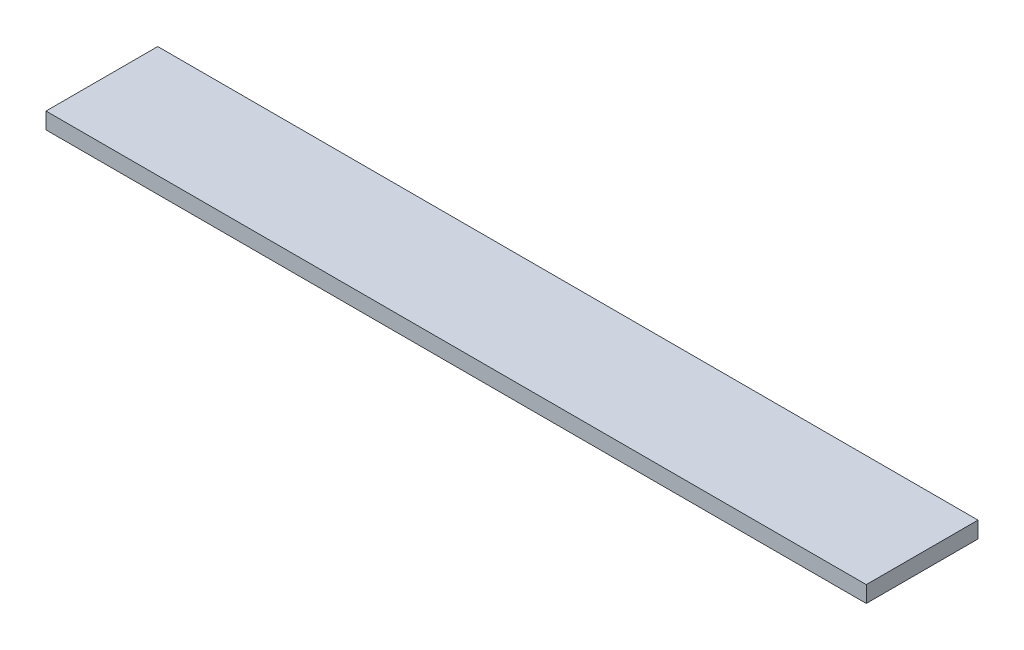
ISO-10303-21;
HEADER;
FILE_DESCRIPTION(('STEP AP214'),'2;1');
FILE_NAME('part.step','',(''),(''),'','','');
FILE_SCHEMA(('AUTOMOTIVE_DESIGN { 1 0 10303 214 1 1 1 1 }'));
ENDSEC;
DATA;
#1=APPLICATION_CONTEXT('core data for automotive mechanical design processes');
#2=APPLICATION_PROTOCOL_DEFINITION('international standard','automotive_design',2000,#1);
#3=PRODUCT_CONTEXT('',#1,'mechanical');
#4=PRODUCT('Part','Part','',(#3));
#5=PRODUCT_RELATED_PRODUCT_CATEGORY('part','',(#4));
#6=PRODUCT_DEFINITION_FORMATION('','',#4);
#7=PRODUCT_DEFINITION_CONTEXT('part definition',#1,'design');
#8=PRODUCT_DEFINITION('design','',#6,#7);
#9=PRODUCT_DEFINITION_SHAPE('','',#8);
#10=(LENGTH_UNIT() NAMED_UNIT(*) SI_UNIT(.MILLI.,.METRE.));
#11=(NAMED_UNIT(*) PLANE_ANGLE_UNIT() SI_UNIT($,.RADIAN.));
#12=(NAMED_UNIT(*) SI_UNIT($,.STERADIAN.) SOLID_ANGLE_UNIT());
#13=UNCERTAINTY_MEASURE_WITH_UNIT(LENGTH_MEASURE(1.E-05),#10,'distance_accuracy_value','');
#14=(GEOMETRIC_REPRESENTATION_CONTEXT(3) GLOBAL_UNCERTAINTY_ASSIGNED_CONTEXT((#13)) GLOBAL_UNIT_ASSIGNED_CONTEXT((#10,
#11,#12)) REPRESENTATION_CONTEXT('',''));
#15=CARTESIAN_POINT('',(0.,0.,0.));
#16=DIRECTION('',(0.,0.,1.));
#17=DIRECTION('',(1.,0.,0.));
#18=AXIS2_PLACEMENT_3D('',#15,#16,#17);
#19=CARTESIAN_POINT('',(0.,1.2,0.));
#20=DIRECTION('',(1.,0.,0.));
#21=DIRECTION('',(0.,0.,-1.));
#22=AXIS2_PLACEMENT_3D('',#19,#20,#21);
#23=PLANE('',#22);
#24=DIRECTION('',(0.,0.,1.));
#25=VECTOR('',#24,1.);
#26=CARTESIAN_POINT('',(0.,0.,0.));
#27=LINE('',#26,#25);
#28=CARTESIAN_POINT('',(0.,0.,0.));
#29=VERTEX_POINT('',#28);
#30=CARTESIAN_POINT('',(0.,0.,8.2));
#31=VERTEX_POINT('',#30);
#32=EDGE_CURVE('E96',#29,#31,#27,.T.);
#33=ORIENTED_EDGE('',*,*,#32,.T.);
#34=DIRECTION('',(0.,-1.,0.));
#35=VECTOR('',#34,1.);
#36=CARTESIAN_POINT('',(0.,1.2,8.2));
#37=LINE('',#36,#35);
#38=CARTESIAN_POINT('',(0.,1.2,8.2));
#39=VERTEX_POINT('',#38);
#40=EDGE_CURVE('E11',#39,#31,#37,.T.);
#41=ORIENTED_EDGE('',*,*,#40,.F.);
#42=DIRECTION('',(0.,0.,1.));
#43=VECTOR('',#42,1.);
#44=CARTESIAN_POINT('',(0.,1.2,0.));
#45=LINE('',#44,#43);
#46=CARTESIAN_POINT('',(0.,1.2,0.));
#47=VERTEX_POINT('',#46);
#48=EDGE_CURVE('E84',#47,#39,#45,.T.);
#49=ORIENTED_EDGE('',*,*,#48,.F.);
#50=DIRECTION('',(0.,-1.,0.));
#51=VECTOR('',#50,1.);
#52=CARTESIAN_POINT('',(0.,1.2,0.));
#53=LINE('',#52,#51);
#54=EDGE_CURVE('E92',#47,#29,#53,.T.);
#55=ORIENTED_EDGE('',*,*,#54,.T.);
#56=EDGE_LOOP('',(#33,#41,#49,#55));
#57=FACE_BOUND('',#56,.T.);
#58=ADVANCED_FACE('F33',(#57),#23,.F.);
#59=CARTESIAN_POINT('',(0.,1.2,8.2));
#60=DIRECTION('',(0.,0.,-1.));
#61=DIRECTION('',(-1.,0.,0.));
#62=AXIS2_PLACEMENT_3D('',#59,#60,#61);
#63=PLANE('',#62);
#64=DIRECTION('',(1.,0.,0.));
#65=VECTOR('',#64,1.);
#66=CARTESIAN_POINT('',(0.,0.,8.2));
#67=LINE('',#66,#65);
#68=CARTESIAN_POINT('',(60.2,0.,8.2));
#69=VERTEX_POINT('',#68);
#70=EDGE_CURVE('E88',#31,#69,#67,.T.);
#71=ORIENTED_EDGE('',*,*,#70,.T.);
#72=DIRECTION('',(0.,-1.,0.));
#73=VECTOR('',#72,1.);
#74=CARTESIAN_POINT('',(60.2,1.2,8.2));
#75=LINE('',#74,#73);
#76=CARTESIAN_POINT('',(60.2,1.2,8.2));
#77=VERTEX_POINT('',#76);
#78=EDGE_CURVE('E41',#77,#69,#75,.T.);
#79=ORIENTED_EDGE('',*,*,#78,.F.);
#80=DIRECTION('',(1.,0.,0.));
#81=VECTOR('',#80,1.);
#82=CARTESIAN_POINT('',(0.,1.2,8.2));
#83=LINE('',#82,#81);
#84=EDGE_CURVE('E79',#39,#77,#83,.T.);
#85=ORIENTED_EDGE('',*,*,#84,.F.);
#86=ORIENTED_EDGE('',*,*,#40,.T.);
#87=EDGE_LOOP('',(#71,#79,#85,#86));
#88=FACE_BOUND('',#87,.T.);
#89=ADVANCED_FACE('F87',(#88),#63,.F.);
#90=CARTESIAN_POINT('',(60.2,1.2,0.));
#91=DIRECTION('',(-1.,0.,0.));
#92=DIRECTION('',(0.,0.,1.));
#93=AXIS2_PLACEMENT_3D('',#90,#91,#92);
#94=PLANE('',#93);
#95=DIRECTION('',(0.,0.,-1.));
#96=VECTOR('',#95,1.);
#97=CARTESIAN_POINT('',(60.2,0.,0.));
#98=LINE('',#97,#96);
#99=CARTESIAN_POINT('',(60.2,0.,0.));
#100=VERTEX_POINT('',#99);
#101=EDGE_CURVE('E66',#69,#100,#98,.T.);
#102=ORIENTED_EDGE('',*,*,#101,.T.);
#103=DIRECTION('',(0.,-1.,0.));
#104=VECTOR('',#103,1.);
#105=CARTESIAN_POINT('',(60.2,1.2,0.));
#106=LINE('',#105,#104);
#107=CARTESIAN_POINT('',(60.2,1.2,0.));
#108=VERTEX_POINT('',#107);
#109=EDGE_CURVE('E89',#108,#100,#106,.T.);
#110=ORIENTED_EDGE('',*,*,#109,.F.);
#111=DIRECTION('',(0.,0.,-1.));
#112=VECTOR('',#111,1.);
#113=CARTESIAN_POINT('',(60.2,1.2,0.));
#114=LINE('',#113,#112);
#115=EDGE_CURVE('E82',#77,#108,#114,.T.);
#116=ORIENTED_EDGE('',*,*,#115,.F.);
#117=ORIENTED_EDGE('',*,*,#78,.T.);
#118=EDGE_LOOP('',(#102,#110,#116,#117));
#119=FACE_BOUND('',#118,.T.);
#120=ADVANCED_FACE('F90',(#119),#94,.F.);
#121=CARTESIAN_POINT('',(0.,1.2,0.));
#122=DIRECTION('',(0.,0.,1.));
#123=DIRECTION('',(1.,0.,0.));
#124=AXIS2_PLACEMENT_3D('',#121,#122,#123);
#125=PLANE('',#124);
#126=DIRECTION('',(-1.,0.,0.));
#127=VECTOR('',#126,1.);
#128=CARTESIAN_POINT('',(0.,0.,0.));
#129=LINE('',#128,#127);
#130=EDGE_CURVE('E72',#100,#29,#129,.T.);
#131=ORIENTED_EDGE('',*,*,#130,.T.);
#132=ORIENTED_EDGE('',*,*,#54,.F.);
#133=DIRECTION('',(-1.,0.,0.));
#134=VECTOR('',#133,1.);
#135=CARTESIAN_POINT('',(0.,1.2,0.));
#136=LINE('',#135,#134);
#137=EDGE_CURVE('E49',#108,#47,#136,.T.);
#138=ORIENTED_EDGE('',*,*,#137,.F.);
#139=ORIENTED_EDGE('',*,*,#109,.T.);
#140=EDGE_LOOP('',(#131,#132,#138,#139));
#141=FACE_BOUND('',#140,.T.);
#142=ADVANCED_FACE('F104',(#141),#125,.F.);
#143=CARTESIAN_POINT('',(0.,1.2,0.));
#144=DIRECTION('',(0.,1.,0.));
#145=DIRECTION('',(0.,0.,1.));
#146=AXIS2_PLACEMENT_3D('',#143,#144,#145);
#147=PLANE('',#146);
#148=ORIENTED_EDGE('',*,*,#48,.T.);
#149=ORIENTED_EDGE('',*,*,#84,.T.);
#150=ORIENTED_EDGE('',*,*,#115,.T.);
#151=ORIENTED_EDGE('',*,*,#137,.T.);
#152=EDGE_LOOP('',(#148,#149,#150,#151));
#153=FACE_BOUND('',#152,.T.);
#154=ADVANCED_FACE('F80',(#153),#147,.T.);
#155=CARTESIAN_POINT('',(0.,0.,0.));
#156=DIRECTION('',(0.,1.,0.));
#157=DIRECTION('',(0.,0.,1.));
#158=AXIS2_PLACEMENT_3D('',#155,#156,#157);
#159=PLANE('',#158);
#160=CARTESIAN_POINT('',(57.8,0.,1.88));
#161=DIRECTION('',(0.,-1.,0.));
#162=DIRECTION('',(0.,0.,-1.));
#163=AXIS2_PLACEMENT_3D('',#160,#161,#162);
#164=CIRCLE('',#163,1.5);
#165=CARTESIAN_POINT('',(57.8,0.,0.379999999999996));
#166=VERTEX_POINT('',#165);
#167=EDGE_CURVE('E122',#166,#166,#164,.T.);
#168=ORIENTED_EDGE('',*,*,#167,.F.);
#169=EDGE_LOOP('',(#168));
#170=FACE_BOUND('',#169,.T.);
#171=CARTESIAN_POINT('',(57.8,0.,6.12));
#172=DIRECTION('',(0.,-1.,0.));
#173=DIRECTION('',(0.,0.,-1.));
#174=AXIS2_PLACEMENT_3D('',#171,#172,#173);
#175=CIRCLE('',#174,1.5);
#176=CARTESIAN_POINT('',(57.8,0.,4.62));
#177=VERTEX_POINT('',#176);
#178=EDGE_CURVE('E116',#177,#177,#175,.T.);
#179=ORIENTED_EDGE('',*,*,#178,.F.);
#180=EDGE_LOOP('',(#179));
#181=FACE_BOUND('',#180,.T.);
#182=CARTESIAN_POINT('',(7.52000000000001,0.,1.87999999999999));
#183=DIRECTION('',(0.,-1.,0.));
#184=DIRECTION('',(0.,0.,-1.));
#185=AXIS2_PLACEMENT_3D('',#182,#183,#184);
#186=CIRCLE('',#185,1.5);
#187=CARTESIAN_POINT('',(7.52000000000001,0.,0.379999999999994));
#188=VERTEX_POINT('',#187);
#189=EDGE_CURVE('E110',#188,#188,#186,.T.);
#190=ORIENTED_EDGE('',*,*,#189,.F.);
#191=EDGE_LOOP('',(#190));
#192=FACE_BOUND('',#191,.T.);
#193=ORIENTED_EDGE('',*,*,#32,.F.);
#194=ORIENTED_EDGE('',*,*,#130,.F.);
#195=ORIENTED_EDGE('',*,*,#101,.F.);
#196=ORIENTED_EDGE('',*,*,#70,.F.);
#197=EDGE_LOOP('',(#193,#194,#195,#196));
#198=FACE_BOUND('',#197,.T.);
#199=ADVANCED_FACE('F107',(#170,#181,#192,#198),#159,.F.);
#200=CARTESIAN_POINT('',(7.52000000000001,0.5,1.87999999999999));
#201=DIRECTION('',(0.,-1.,0.));
#202=DIRECTION('',(0.,0.,-1.));
#203=AXIS2_PLACEMENT_3D('',#200,#201,#202);
#204=CYLINDRICAL_SURFACE('',#203,1.5);
#205=CARTESIAN_POINT('',(7.52000000000001,0.5,1.87999999999999));
#206=DIRECTION('',(0.,-1.,0.));
#207=DIRECTION('',(0.,0.,-1.));
#208=AXIS2_PLACEMENT_3D('',#205,#206,#207);
#209=CIRCLE('',#208,1.5);
#210=CARTESIAN_POINT('',(7.52000000000001,0.5,0.379999999999994));
#211=VERTEX_POINT('',#210);
#212=EDGE_CURVE('E99',#211,#211,#209,.T.);
#213=ORIENTED_EDGE('',*,*,#212,.F.);
#214=EDGE_LOOP('',(#213));
#215=FACE_BOUND('',#214,.T.);
#216=ORIENTED_EDGE('',*,*,#189,.T.);
#217=EDGE_LOOP('',(#216));
#218=FACE_BOUND('',#217,.T.);
#219=ADVANCED_FACE('F139',(#215,#218),#204,.F.);
#220=CARTESIAN_POINT('',(7.52000000000001,0.5,1.87999999999999));
#221=DIRECTION('',(0.,-1.,0.));
#222=DIRECTION('',(0.,0.,-1.));
#223=AXIS2_PLACEMENT_3D('',#220,#221,#222);
#224=PLANE('',#223);
#225=ORIENTED_EDGE('',*,*,#212,.T.);
#226=EDGE_LOOP('',(#225));
#227=FACE_BOUND('',#226,.T.);
#228=ADVANCED_FACE('F146',(#227),#224,.T.);
#229=CARTESIAN_POINT('',(57.8,0.5,6.12));
#230=DIRECTION('',(0.,-1.,0.));
#231=DIRECTION('',(0.,0.,-1.));
#232=AXIS2_PLACEMENT_3D('',#229,#230,#231);
#233=CYLINDRICAL_SURFACE('',#232,1.5);
#234=CARTESIAN_POINT('',(57.8,0.5,6.12));
#235=DIRECTION('',(0.,-1.,0.));
#236=DIRECTION('',(0.,0.,-1.));
#237=AXIS2_PLACEMENT_3D('',#234,#235,#236);
#238=CIRCLE('',#237,1.5);
#239=CARTESIAN_POINT('',(57.8,0.5,4.62));
#240=VERTEX_POINT('',#239);
#241=EDGE_CURVE('E119',#240,#240,#238,.T.);
#242=ORIENTED_EDGE('',*,*,#241,.F.);
#243=EDGE_LOOP('',(#242));
#244=FACE_BOUND('',#243,.T.);
#245=ORIENTED_EDGE('',*,*,#178,.T.);
#246=EDGE_LOOP('',(#245));
#247=FACE_BOUND('',#246,.T.);
#248=ADVANCED_FACE('F153',(#244,#247),#233,.F.);
#249=CARTESIAN_POINT('',(57.8,0.5,6.12));
#250=DIRECTION('',(0.,-1.,0.));
#251=DIRECTION('',(0.,0.,-1.));
#252=AXIS2_PLACEMENT_3D('',#249,#250,#251);
#253=PLANE('',#252);
#254=ORIENTED_EDGE('',*,*,#241,.T.);
#255=EDGE_LOOP('',(#254));
#256=FACE_BOUND('',#255,.T.);
#257=ADVANCED_FACE('F133',(#256),#253,.T.);
#258=CARTESIAN_POINT('',(57.8,0.5,1.88));
#259=DIRECTION('',(0.,-1.,0.));
#260=DIRECTION('',(0.,0.,-1.));
#261=AXIS2_PLACEMENT_3D('',#258,#259,#260);
#262=CYLINDRICAL_SURFACE('',#261,1.5);
#263=CARTESIAN_POINT('',(57.8,0.5,1.88));
#264=DIRECTION('',(0.,-1.,0.));
#265=DIRECTION('',(0.,0.,-1.));
#266=AXIS2_PLACEMENT_3D('',#263,#264,#265);
#267=CIRCLE('',#266,1.5);
#268=CARTESIAN_POINT('',(57.8,0.5,0.379999999999996));
#269=VERTEX_POINT('',#268);
#270=EDGE_CURVE('E113',#269,#269,#267,.T.);
#271=ORIENTED_EDGE('',*,*,#270,.F.);
#272=EDGE_LOOP('',(#271));
#273=FACE_BOUND('',#272,.T.);
#274=ORIENTED_EDGE('',*,*,#167,.T.);
#275=EDGE_LOOP('',(#274));
#276=FACE_BOUND('',#275,.T.);
#277=ADVANCED_FACE('F130',(#273,#276),#262,.F.);
#278=CARTESIAN_POINT('',(57.8,0.5,1.88));
#279=DIRECTION('',(0.,-1.,0.));
#280=DIRECTION('',(0.,0.,-1.));
#281=AXIS2_PLACEMENT_3D('',#278,#279,#280);
#282=PLANE('',#281);
#283=ORIENTED_EDGE('',*,*,#270,.T.);
#284=EDGE_LOOP('',(#283));
#285=FACE_BOUND('',#284,.T.);
#286=ADVANCED_FACE('F128',(#285),#282,.T.);
#287=CLOSED_SHELL('',(#58,#89,#120,#142,#154,#199,#219,#228,#248,#257,#277,#286));
#288=MANIFOLD_SOLID_BREP('B2',#287);
#289=ADVANCED_BREP_SHAPE_REPRESENTATION('',(#18,#288),#14);
#290=SHAPE_DEFINITION_REPRESENTATION(#9,#289);
ENDSEC;
END-ISO-10303-21;
